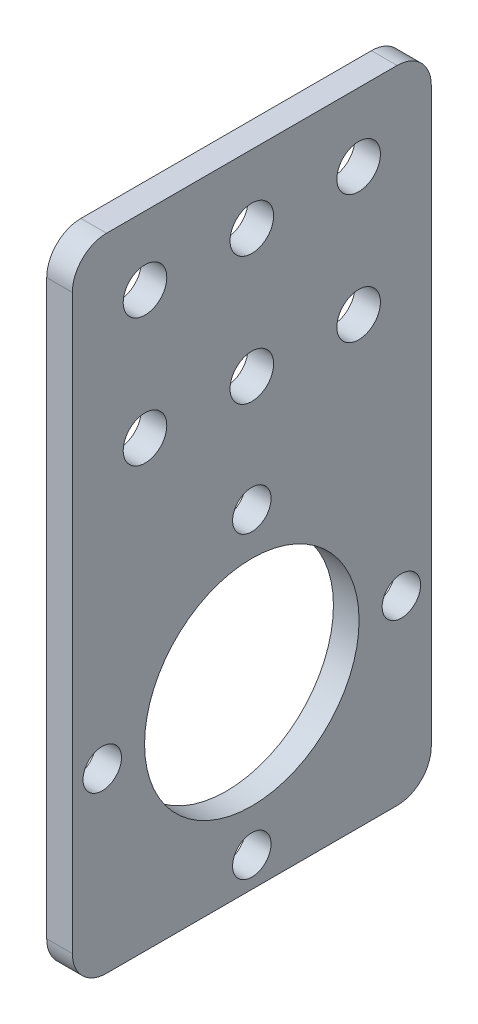
ISO-10303-21;
HEADER;
FILE_DESCRIPTION(('STEP AP214'),'2;1');
FILE_NAME('part.step','',(''),(''),'','','');
FILE_SCHEMA(('AUTOMOTIVE_DESIGN { 1 0 10303 214 1 1 1 1 }'));
ENDSEC;
DATA;
#1=APPLICATION_CONTEXT('core data for automotive mechanical design processes');
#2=APPLICATION_PROTOCOL_DEFINITION('international standard','automotive_design',2000,#1);
#3=PRODUCT_CONTEXT('',#1,'mechanical');
#4=PRODUCT('Part','Part','',(#3));
#5=PRODUCT_RELATED_PRODUCT_CATEGORY('part','',(#4));
#6=PRODUCT_DEFINITION_FORMATION('','',#4);
#7=PRODUCT_DEFINITION_CONTEXT('part definition',#1,'design');
#8=PRODUCT_DEFINITION('design','',#6,#7);
#9=PRODUCT_DEFINITION_SHAPE('','',#8);
#10=(LENGTH_UNIT() NAMED_UNIT(*) SI_UNIT(.MILLI.,.METRE.));
#11=(NAMED_UNIT(*) PLANE_ANGLE_UNIT() SI_UNIT($,.RADIAN.));
#12=(NAMED_UNIT(*) SI_UNIT($,.STERADIAN.) SOLID_ANGLE_UNIT());
#13=UNCERTAINTY_MEASURE_WITH_UNIT(LENGTH_MEASURE(1.E-05),#10,'distance_accuracy_value','');
#14=(GEOMETRIC_REPRESENTATION_CONTEXT(3) GLOBAL_UNCERTAINTY_ASSIGNED_CONTEXT((#13)) GLOBAL_UNIT_ASSIGNED_CONTEXT((#10,
#11,#12)) REPRESENTATION_CONTEXT('',''));
#15=CARTESIAN_POINT('',(0.,0.,0.));
#16=DIRECTION('',(0.,0.,1.));
#17=DIRECTION('',(1.,0.,0.));
#18=AXIS2_PLACEMENT_3D('',#15,#16,#17);
#19=CARTESIAN_POINT('',(-12.4999900001975,-16.9999999999864,-464.831385650778));
#20=DIRECTION('',(1.,3.56744395928794E-13,-3.81916720471054E-13));
#21=DIRECTION('',(-3.56744395928794E-13,1.,0.));
#22=AXIS2_PLACEMENT_3D('',#19,#20,#21);
#23=PLANE('',#22);
#24=CARTESIAN_POINT('',(-12.4999900002162,31.0000100000136,-469.331385650778));
#25=DIRECTION('',(-1.,-3.56744395928794E-13,3.81916720471054E-13));
#26=DIRECTION('',(-3.56744395928794E-13,1.,0.));
#27=AXIS2_PLACEMENT_3D('',#24,#25,#26);
#28=CIRCLE('',#27,2.55);
#29=CARTESIAN_POINT('',(-12.4999900002171,33.5500100000136,-469.331385650778));
#30=VERTEX_POINT('',#29);
#31=EDGE_CURVE('E389',#30,#30,#28,.T.);
#32=ORIENTED_EDGE('',*,*,#31,.T.);
#33=EDGE_LOOP('',(#32));
#34=FACE_BOUND('',#33,.T.);
#35=CARTESIAN_POINT('',(-12.49999000021,1.35622800243338E-11,-481.831385650778));
#36=DIRECTION('',(-1.,-3.56744395928794E-13,3.81916720471054E-13));
#37=DIRECTION('',(-3.56744395928794E-13,1.,0.));
#38=AXIS2_PLACEMENT_3D('',#35,#36,#37);
#39=CIRCLE('',#38,12.55);
#40=CARTESIAN_POINT('',(-12.4999900002145,12.5500000000136,-481.831385650778));
#41=VERTEX_POINT('',#40);
#42=EDGE_CURVE('E400',#41,#41,#39,.T.);
#43=ORIENTED_EDGE('',*,*,#42,.T.);
#44=EDGE_LOOP('',(#43));
#45=FACE_BOUND('',#44,.T.);
#46=CARTESIAN_POINT('',(-12.4999900002217,46.0000100000136,-469.331385650778));
#47=DIRECTION('',(-1.,-3.56744395928794E-13,3.81916720471054E-13));
#48=DIRECTION('',(-3.56744395928794E-13,1.,0.));
#49=AXIS2_PLACEMENT_3D('',#46,#47,#48);
#50=CIRCLE('',#49,2.55);
#51=CARTESIAN_POINT('',(-12.4999900002226,48.5500100000136,-469.331385650778));
#52=VERTEX_POINT('',#51);
#53=EDGE_CURVE('E412',#52,#52,#50,.T.);
#54=ORIENTED_EDGE('',*,*,#53,.T.);
#55=EDGE_LOOP('',(#54));
#56=FACE_BOUND('',#55,.T.);
#57=CARTESIAN_POINT('',(-12.4999900002162,17.5000000000136,-481.831385650778));
#58=DIRECTION('',(-1.,-3.56744395928794E-13,3.81916720471054E-13));
#59=DIRECTION('',(-3.56744395928794E-13,1.,0.));
#60=AXIS2_PLACEMENT_3D('',#57,#58,#59);
#61=CIRCLE('',#60,2.25);
#62=CARTESIAN_POINT('',(-12.499990000217,19.7500000000136,-481.831385650778));
#63=VERTEX_POINT('',#62);
#64=EDGE_CURVE('E424',#63,#63,#61,.T.);
#65=ORIENTED_EDGE('',*,*,#64,.T.);
#66=EDGE_LOOP('',(#65));
#67=FACE_BOUND('',#66,.T.);
#68=CARTESIAN_POINT('',(-12.4999900002038,-17.4999999999864,-481.831385650778));
#69=DIRECTION('',(-1.,-3.56744395928794E-13,3.81916720471054E-13));
#70=DIRECTION('',(-3.56744395928794E-13,1.,0.));
#71=AXIS2_PLACEMENT_3D('',#68,#69,#70);
#72=CIRCLE('',#71,2.25);
#73=CARTESIAN_POINT('',(-12.4999900002046,-15.2499999999864,-481.831385650778));
#74=VERTEX_POINT('',#73);
#75=EDGE_CURVE('E436',#74,#74,#72,.T.);
#76=ORIENTED_EDGE('',*,*,#75,.T.);
#77=EDGE_LOOP('',(#76));
#78=FACE_BOUND('',#77,.T.);
#79=CARTESIAN_POINT('',(-12.4999900001975,-16.9999999999864,-464.831385650778));
#80=DIRECTION('',(-1.,-3.56744395928794E-13,3.81916720471054E-13));
#81=DIRECTION('',(-3.56744395928794E-13,1.,0.));
#82=AXIS2_PLACEMENT_3D('',#79,#80,#81);
#83=CIRCLE('',#82,4.);
#84=CARTESIAN_POINT('',(-12.499990000196,-20.9999999999864,-464.831385650778));
#85=VERTEX_POINT('',#84);
#86=CARTESIAN_POINT('',(-12.499990000196,-16.9999999999864,-460.831385650778));
#87=VERTEX_POINT('',#86);
#88=EDGE_CURVE('E151',#85,#87,#83,.T.);
#89=ORIENTED_EDGE('',*,*,#88,.F.);
#90=DIRECTION('',(3.81916720471054E-13,0.,1.));
#91=VECTOR('',#90,1.);
#92=CARTESIAN_POINT('',(-12.499990000209,-20.9999999999864,-498.831385650778));
#93=LINE('',#92,#91);
#94=CARTESIAN_POINT('',(-12.499990000209,-20.9999999999864,-498.831385650778));
#95=VERTEX_POINT('',#94);
#96=EDGE_CURVE('E125',#95,#85,#93,.T.);
#97=ORIENTED_EDGE('',*,*,#96,.F.);
#98=CARTESIAN_POINT('',(-12.4999900002103,-16.9999999999864,-498.831385650778));
#99=DIRECTION('',(-1.,-3.56744395928794E-13,3.81916720471054E-13));
#100=DIRECTION('',(3.56744395928794E-13,-1.,0.));
#101=AXIS2_PLACEMENT_3D('',#98,#99,#100);
#102=CIRCLE('',#101,4.);
#103=CARTESIAN_POINT('',(-12.4999900002119,-16.9999999999864,-502.831385650778));
#104=VERTEX_POINT('',#103);
#105=EDGE_CURVE('E106',#104,#95,#102,.T.);
#106=ORIENTED_EDGE('',*,*,#105,.F.);
#107=DIRECTION('',(3.56731642567291E-13,-1.,0.));
#108=VECTOR('',#107,1.);
#109=CARTESIAN_POINT('',(-12.4999900002119,-16.9999999999864,-502.831385650778));
#110=LINE('',#109,#108);
#111=CARTESIAN_POINT('',(-12.4999900002359,50.0000000000135,-502.831385650778));
#112=VERTEX_POINT('',#111);
#113=EDGE_CURVE('E116',#112,#104,#110,.T.);
#114=ORIENTED_EDGE('',*,*,#113,.F.);
#115=CARTESIAN_POINT('',(-12.4999900002343,50.0000000000136,-498.831385650778));
#116=DIRECTION('',(-1.,-3.56744395928794E-13,3.81916720471054E-13));
#117=DIRECTION('',(3.56744395928794E-13,-1.,0.));
#118=AXIS2_PLACEMENT_3D('',#115,#116,#117);
#119=CIRCLE('',#118,4.);
#120=CARTESIAN_POINT('',(-12.4999900002357,54.0000000000136,-498.831385650778));
#121=VERTEX_POINT('',#120);
#122=EDGE_CURVE('E121',#121,#112,#119,.T.);
#123=ORIENTED_EDGE('',*,*,#122,.F.);
#124=DIRECTION('',(-3.81916720471054E-13,0.,-1.));
#125=VECTOR('',#124,1.);
#126=CARTESIAN_POINT('',(-12.4999900002357,54.0000000000136,-498.831385650778));
#127=LINE('',#126,#125);
#128=CARTESIAN_POINT('',(-12.4999900002228,54.0000000000136,-464.831385650778));
#129=VERTEX_POINT('',#128);
#130=EDGE_CURVE('E177',#129,#121,#127,.T.);
#131=ORIENTED_EDGE('',*,*,#130,.F.);
#132=CARTESIAN_POINT('',(-12.4999900002213,50.0000000000136,-464.831385650778));
#133=DIRECTION('',(-1.,-3.56744395928794E-13,3.81916720471054E-13));
#134=DIRECTION('',(3.56744395928794E-13,-1.,0.));
#135=AXIS2_PLACEMENT_3D('',#132,#133,#134);
#136=CIRCLE('',#135,4.);
#137=CARTESIAN_POINT('',(-12.49999000022,50.0000000000135,-460.831385650778));
#138=VERTEX_POINT('',#137);
#139=EDGE_CURVE('E170',#138,#129,#136,.T.);
#140=ORIENTED_EDGE('',*,*,#139,.F.);
#141=DIRECTION('',(-3.56731642567291E-13,1.,0.));
#142=VECTOR('',#141,1.);
#143=CARTESIAN_POINT('',(-12.499990000196,-16.9999999999864,-460.831385650778));
#144=LINE('',#143,#142);
#145=EDGE_CURVE('E160',#87,#138,#144,.T.);
#146=ORIENTED_EDGE('',*,*,#145,.F.);
#147=EDGE_LOOP('',(#89,#97,#106,#114,#123,#131,#140,#146));
#148=FACE_BOUND('',#147,.T.);
#149=CARTESIAN_POINT('',(-12.4999900002166,1.35622859668917E-11,-499.331385650778));
#150=DIRECTION('',(-1.,-3.56744395928794E-13,3.81916720471054E-13));
#151=DIRECTION('',(-3.56744395928794E-13,1.,0.));
#152=AXIS2_PLACEMENT_3D('',#149,#150,#151);
#153=CIRCLE('',#152,2.25);
#154=CARTESIAN_POINT('',(-12.4999900002174,2.25000000001356,-499.331385650778));
#155=VERTEX_POINT('',#154);
#156=EDGE_CURVE('E134',#155,#155,#153,.T.);
#157=ORIENTED_EDGE('',*,*,#156,.T.);
#158=EDGE_LOOP('',(#157));
#159=FACE_BOUND('',#158,.T.);
#160=CARTESIAN_POINT('',(-12.4999900002032,1.35622859668917E-11,-464.331385650778));
#161=DIRECTION('',(-1.,-3.56744395928794E-13,3.81916720471054E-13));
#162=DIRECTION('',(-3.56744395928794E-13,1.,0.));
#163=AXIS2_PLACEMENT_3D('',#160,#161,#162);
#164=CIRCLE('',#163,2.25);
#165=CARTESIAN_POINT('',(-12.499990000204,2.25000000001357,-464.331385650778));
#166=VERTEX_POINT('',#165);
#167=EDGE_CURVE('E430',#166,#166,#164,.T.);
#168=ORIENTED_EDGE('',*,*,#167,.T.);
#169=EDGE_LOOP('',(#168));
#170=FACE_BOUND('',#169,.T.);
#171=CARTESIAN_POINT('',(-12.4999900002264,46.0000100000136,-481.831385650778));
#172=DIRECTION('',(-1.,-3.56744395928794E-13,3.81916720471054E-13));
#173=DIRECTION('',(-3.56744395928794E-13,1.,0.));
#174=AXIS2_PLACEMENT_3D('',#171,#172,#173);
#175=CIRCLE('',#174,2.55);
#176=CARTESIAN_POINT('',(-12.4999900002274,48.5500100000136,-481.831385650778));
#177=VERTEX_POINT('',#176);
#178=EDGE_CURVE('E418',#177,#177,#175,.T.);
#179=ORIENTED_EDGE('',*,*,#178,.T.);
#180=EDGE_LOOP('',(#179));
#181=FACE_BOUND('',#180,.T.);
#182=CARTESIAN_POINT('',(-12.4999900002312,46.0000100000136,-494.331385650778));
#183=DIRECTION('',(-1.,-3.56744395928794E-13,3.81916720471054E-13));
#184=DIRECTION('',(-3.56744395928794E-13,1.,0.));
#185=AXIS2_PLACEMENT_3D('',#182,#183,#184);
#186=CIRCLE('',#185,2.55);
#187=CARTESIAN_POINT('',(-12.4999900002321,48.5500100000136,-494.331385650778));
#188=VERTEX_POINT('',#187);
#189=EDGE_CURVE('E406',#188,#188,#186,.T.);
#190=ORIENTED_EDGE('',*,*,#189,.T.);
#191=EDGE_LOOP('',(#190));
#192=FACE_BOUND('',#191,.T.);
#193=CARTESIAN_POINT('',(-12.4999900002211,31.0000100000136,-481.831385650778));
#194=DIRECTION('',(-1.,-3.56744395928794E-13,3.81916720471054E-13));
#195=DIRECTION('',(-3.56744395928794E-13,1.,0.));
#196=AXIS2_PLACEMENT_3D('',#193,#194,#195);
#197=CIRCLE('',#196,2.55);
#198=CARTESIAN_POINT('',(-12.499990000222,33.5500100000136,-481.831385650778));
#199=VERTEX_POINT('',#198);
#200=EDGE_CURVE('E394',#199,#199,#197,.T.);
#201=ORIENTED_EDGE('',*,*,#200,.T.);
#202=EDGE_LOOP('',(#201));
#203=FACE_BOUND('',#202,.T.);
#204=CARTESIAN_POINT('',(-12.4999900002258,31.0000100000136,-494.331385650778));
#205=DIRECTION('',(-1.,-3.56744395928794E-13,3.81916720471054E-13));
#206=DIRECTION('',(-3.56744395928794E-13,1.,0.));
#207=AXIS2_PLACEMENT_3D('',#204,#205,#206);
#208=CIRCLE('',#207,2.55);
#209=CARTESIAN_POINT('',(-12.4999900002267,33.5500100000136,-494.331385650778));
#210=VERTEX_POINT('',#209);
#211=EDGE_CURVE('E380',#210,#210,#208,.T.);
#212=ORIENTED_EDGE('',*,*,#211,.T.);
#213=EDGE_LOOP('',(#212));
#214=FACE_BOUND('',#213,.T.);
#215=ADVANCED_FACE('F33',(#34,#45,#56,#67,#78,#148,#159,#170,#181,#192,#203,#214),#23,.T.);
#216=CARTESIAN_POINT('',(-15.4999900001974,-16.9999999999875,-464.831385650777));
#217=DIRECTION('',(1.,3.56744395928794E-13,-3.81916720471054E-13));
#218=DIRECTION('',(-3.56744395928794E-13,1.,0.));
#219=AXIS2_PLACEMENT_3D('',#216,#217,#218);
#220=PLANE('',#219);
#221=CARTESIAN_POINT('',(-15.4999900001974,-16.9999999999875,-464.831385650777));
#222=DIRECTION('',(-1.,-3.56744395928794E-13,3.81916720471054E-13));
#223=DIRECTION('',(-3.56744395928794E-13,1.,0.));
#224=AXIS2_PLACEMENT_3D('',#221,#222,#223);
#225=CIRCLE('',#224,4.);
#226=CARTESIAN_POINT('',(-15.4999900001961,-20.9999999999875,-464.831385650777));
#227=VERTEX_POINT('',#226);
#228=CARTESIAN_POINT('',(-15.4999900001959,-16.9999999999875,-460.831385650777));
#229=VERTEX_POINT('',#228);
#230=EDGE_CURVE('E130',#227,#229,#225,.T.);
#231=ORIENTED_EDGE('',*,*,#230,.T.);
#232=DIRECTION('',(-3.56731642567291E-13,1.,0.));
#233=VECTOR('',#232,1.);
#234=CARTESIAN_POINT('',(-15.4999900001959,-16.9999999999875,-460.831385650777));
#235=LINE('',#234,#233);
#236=CARTESIAN_POINT('',(-15.4999900002198,50.0000000000124,-460.831385650777));
#237=VERTEX_POINT('',#236);
#238=EDGE_CURVE('E133',#229,#237,#235,.T.);
#239=ORIENTED_EDGE('',*,*,#238,.T.);
#240=CARTESIAN_POINT('',(-15.4999900002214,50.0000000000125,-464.831385650777));
#241=DIRECTION('',(-1.,-3.56744395928794E-13,3.81916720471054E-13));
#242=DIRECTION('',(3.56744395928794E-13,-1.,0.));
#243=AXIS2_PLACEMENT_3D('',#240,#241,#242);
#244=CIRCLE('',#243,4.);
#245=CARTESIAN_POINT('',(-15.4999900002227,54.0000000000125,-464.831385650777));
#246=VERTEX_POINT('',#245);
#247=EDGE_CURVE('E137',#237,#246,#244,.T.);
#248=ORIENTED_EDGE('',*,*,#247,.T.);
#249=DIRECTION('',(-3.81916720471054E-13,0.,-1.));
#250=VECTOR('',#249,1.);
#251=CARTESIAN_POINT('',(-15.4999900002358,54.0000000000125,-498.831385650777));
#252=LINE('',#251,#250);
#253=CARTESIAN_POINT('',(-15.4999900002358,54.0000000000125,-498.831385650777));
#254=VERTEX_POINT('',#253);
#255=EDGE_CURVE('E140',#246,#254,#252,.T.);
#256=ORIENTED_EDGE('',*,*,#255,.T.);
#257=CARTESIAN_POINT('',(-15.4999900002344,50.0000000000125,-498.831385650777));
#258=DIRECTION('',(-1.,-3.56744395928794E-13,3.81916720471054E-13));
#259=DIRECTION('',(3.56744395928794E-13,-1.,0.));
#260=AXIS2_PLACEMENT_3D('',#257,#258,#259);
#261=CIRCLE('',#260,4.);
#262=CARTESIAN_POINT('',(-15.4999900002358,50.0000000000124,-502.831385650777));
#263=VERTEX_POINT('',#262);
#264=EDGE_CURVE('E143',#254,#263,#261,.T.);
#265=ORIENTED_EDGE('',*,*,#264,.T.);
#266=DIRECTION('',(3.56731642567291E-13,-1.,0.));
#267=VECTOR('',#266,1.);
#268=CARTESIAN_POINT('',(-15.499990000212,-16.9999999999875,-502.831385650777));
#269=LINE('',#268,#267);
#270=CARTESIAN_POINT('',(-15.499990000212,-16.9999999999875,-502.831385650777));
#271=VERTEX_POINT('',#270);
#272=EDGE_CURVE('E146',#263,#271,#269,.T.);
#273=ORIENTED_EDGE('',*,*,#272,.T.);
#274=CARTESIAN_POINT('',(-15.4999900002105,-16.9999999999875,-498.831385650777));
#275=DIRECTION('',(-1.,-3.56744395928794E-13,3.81916720471054E-13));
#276=DIRECTION('',(3.56744395928794E-13,-1.,0.));
#277=AXIS2_PLACEMENT_3D('',#274,#275,#276);
#278=CIRCLE('',#277,4.);
#279=CARTESIAN_POINT('',(-15.4999900002089,-20.9999999999875,-498.831385650777));
#280=VERTEX_POINT('',#279);
#281=EDGE_CURVE('E109',#271,#280,#278,.T.);
#282=ORIENTED_EDGE('',*,*,#281,.T.);
#283=DIRECTION('',(3.81916720471054E-13,0.,1.));
#284=VECTOR('',#283,1.);
#285=CARTESIAN_POINT('',(-15.4999900002089,-20.9999999999875,-498.831385650777));
#286=LINE('',#285,#284);
#287=EDGE_CURVE('E149',#280,#227,#286,.T.);
#288=ORIENTED_EDGE('',*,*,#287,.T.);
#289=EDGE_LOOP('',(#231,#239,#248,#256,#265,#273,#282,#288));
#290=FACE_BOUND('',#289,.T.);
#291=CARTESIAN_POINT('',(-15.4999900002167,1.24920527791054E-11,-499.331385650777));
#292=DIRECTION('',(-1.,-3.56744395928794E-13,3.81916720471054E-13));
#293=DIRECTION('',(-3.56744395928794E-13,1.,0.));
#294=AXIS2_PLACEMENT_3D('',#291,#292,#293);
#295=CIRCLE('',#294,2.25);
#296=CARTESIAN_POINT('',(-15.4999900002175,2.25000000001249,-499.331385650777));
#297=VERTEX_POINT('',#296);
#298=EDGE_CURVE('E173',#297,#297,#295,.T.);
#299=ORIENTED_EDGE('',*,*,#298,.F.);
#300=EDGE_LOOP('',(#299));
#301=FACE_BOUND('',#300,.T.);
#302=CARTESIAN_POINT('',(-15.4999900002037,-17.4999999999875,-481.831385650777));
#303=DIRECTION('',(-1.,-3.56744395928794E-13,3.81916720471054E-13));
#304=DIRECTION('',(-3.56744395928794E-13,1.,0.));
#305=AXIS2_PLACEMENT_3D('',#302,#303,#304);
#306=CIRCLE('',#305,2.25);
#307=CARTESIAN_POINT('',(-15.4999900002045,-15.2499999999875,-481.831385650777));
#308=VERTEX_POINT('',#307);
#309=EDGE_CURVE('E433',#308,#308,#306,.T.);
#310=ORIENTED_EDGE('',*,*,#309,.F.);
#311=EDGE_LOOP('',(#310));
#312=FACE_BOUND('',#311,.T.);
#313=CARTESIAN_POINT('',(-15.4999900002034,1.24920527791054E-11,-464.331385650777));
#314=DIRECTION('',(-1.,-3.56744395928794E-13,3.81916720471054E-13));
#315=DIRECTION('',(-3.56744395928794E-13,1.,0.));
#316=AXIS2_PLACEMENT_3D('',#313,#314,#315);
#317=CIRCLE('',#316,2.25);
#318=CARTESIAN_POINT('',(-15.4999900002042,2.25000000001249,-464.331385650777));
#319=VERTEX_POINT('',#318);
#320=EDGE_CURVE('E427',#319,#319,#317,.T.);
#321=ORIENTED_EDGE('',*,*,#320,.F.);
#322=EDGE_LOOP('',(#321));
#323=FACE_BOUND('',#322,.T.);
#324=CARTESIAN_POINT('',(-15.4999900002163,17.5000000000125,-481.831385650777));
#325=DIRECTION('',(-1.,-3.56744395928794E-13,3.81916720471054E-13));
#326=DIRECTION('',(-3.56744395928794E-13,1.,0.));
#327=AXIS2_PLACEMENT_3D('',#324,#325,#326);
#328=CIRCLE('',#327,2.25);
#329=CARTESIAN_POINT('',(-15.4999900002171,19.7500000000125,-481.831385650777));
#330=VERTEX_POINT('',#329);
#331=EDGE_CURVE('E421',#330,#330,#328,.T.);
#332=ORIENTED_EDGE('',*,*,#331,.F.);
#333=EDGE_LOOP('',(#332));
#334=FACE_BOUND('',#333,.T.);
#335=CARTESIAN_POINT('',(-15.4999900002263,46.0000100000125,-481.831385650777));
#336=DIRECTION('',(-1.,-3.56744395928794E-13,3.81916720471054E-13));
#337=DIRECTION('',(-3.56744395928794E-13,1.,0.));
#338=AXIS2_PLACEMENT_3D('',#335,#336,#337);
#339=CIRCLE('',#338,2.55);
#340=CARTESIAN_POINT('',(-15.4999900002272,48.5500100000125,-481.831385650777));
#341=VERTEX_POINT('',#340);
#342=EDGE_CURVE('E415',#341,#341,#339,.T.);
#343=ORIENTED_EDGE('',*,*,#342,.F.);
#344=EDGE_LOOP('',(#343));
#345=FACE_BOUND('',#344,.T.);
#346=CARTESIAN_POINT('',(-15.4999900002216,46.0000100000125,-469.331385650777));
#347=DIRECTION('',(-1.,-3.56744395928794E-13,3.81916720471054E-13));
#348=DIRECTION('',(-3.56744395928794E-13,1.,0.));
#349=AXIS2_PLACEMENT_3D('',#346,#347,#348);
#350=CIRCLE('',#349,2.55);
#351=CARTESIAN_POINT('',(-15.4999900002225,48.5500100000125,-469.331385650777));
#352=VERTEX_POINT('',#351);
#353=EDGE_CURVE('E409',#352,#352,#350,.T.);
#354=ORIENTED_EDGE('',*,*,#353,.F.);
#355=EDGE_LOOP('',(#354));
#356=FACE_BOUND('',#355,.T.);
#357=CARTESIAN_POINT('',(-15.4999900002313,46.0000100000125,-494.331385650777));
#358=DIRECTION('',(-1.,-3.56744395928794E-13,3.81916720471054E-13));
#359=DIRECTION('',(-3.56744395928794E-13,1.,0.));
#360=AXIS2_PLACEMENT_3D('',#357,#358,#359);
#361=CIRCLE('',#360,2.55);
#362=CARTESIAN_POINT('',(-15.4999900002322,48.5500100000125,-494.331385650777));
#363=VERTEX_POINT('',#362);
#364=EDGE_CURVE('E403',#363,#363,#361,.T.);
#365=ORIENTED_EDGE('',*,*,#364,.F.);
#366=EDGE_LOOP('',(#365));
#367=FACE_BOUND('',#366,.T.);
#368=CARTESIAN_POINT('',(-15.4999900002099,1.24920468365474E-11,-481.831385650777));
#369=DIRECTION('',(-1.,-3.56744395928794E-13,3.81916720471054E-13));
#370=DIRECTION('',(-3.56744395928794E-13,1.,0.));
#371=AXIS2_PLACEMENT_3D('',#368,#369,#370);
#372=CIRCLE('',#371,12.55);
#373=CARTESIAN_POINT('',(-15.4999900002144,12.5500000000125,-481.831385650777));
#374=VERTEX_POINT('',#373);
#375=EDGE_CURVE('E397',#374,#374,#372,.T.);
#376=ORIENTED_EDGE('',*,*,#375,.F.);
#377=EDGE_LOOP('',(#376));
#378=FACE_BOUND('',#377,.T.);
#379=CARTESIAN_POINT('',(-15.499990000221,31.0000100000125,-481.831385650777));
#380=DIRECTION('',(-1.,-3.56744395928794E-13,3.81916720471054E-13));
#381=DIRECTION('',(-3.56744395928794E-13,1.,0.));
#382=AXIS2_PLACEMENT_3D('',#379,#380,#381);
#383=CIRCLE('',#382,2.55);
#384=CARTESIAN_POINT('',(-15.4999900002219,33.5500100000125,-481.831385650777));
#385=VERTEX_POINT('',#384);
#386=EDGE_CURVE('E391',#385,#385,#383,.T.);
#387=ORIENTED_EDGE('',*,*,#386,.F.);
#388=EDGE_LOOP('',(#387));
#389=FACE_BOUND('',#388,.T.);
#390=CARTESIAN_POINT('',(-15.4999900002163,31.0000100000125,-469.331385650777));
#391=DIRECTION('',(-1.,-3.56744395928794E-13,3.81916720471054E-13));
#392=DIRECTION('',(-3.56744395928794E-13,1.,0.));
#393=AXIS2_PLACEMENT_3D('',#390,#391,#392);
#394=CIRCLE('',#393,2.55);
#395=CARTESIAN_POINT('',(-15.4999900002172,33.5500100000125,-469.331385650777));
#396=VERTEX_POINT('',#395);
#397=EDGE_CURVE('E386',#396,#396,#394,.T.);
#398=ORIENTED_EDGE('',*,*,#397,.F.);
#399=EDGE_LOOP('',(#398));
#400=FACE_BOUND('',#399,.T.);
#401=CARTESIAN_POINT('',(-15.4999900002257,31.0000100000125,-494.331385650777));
#402=DIRECTION('',(-1.,-3.56744395928794E-13,3.81916720471054E-13));
#403=DIRECTION('',(-3.56744395928794E-13,1.,0.));
#404=AXIS2_PLACEMENT_3D('',#401,#402,#403);
#405=CIRCLE('',#404,2.55);
#406=CARTESIAN_POINT('',(-15.4999900002266,33.5500100000125,-494.331385650777));
#407=VERTEX_POINT('',#406);
#408=EDGE_CURVE('E383',#407,#407,#405,.T.);
#409=ORIENTED_EDGE('',*,*,#408,.F.);
#410=EDGE_LOOP('',(#409));
#411=FACE_BOUND('',#410,.T.);
#412=ADVANCED_FACE('F167',(#290,#301,#312,#323,#334,#345,#356,#367,#378,#389,#400,#411),#220,.F.);
#413=CARTESIAN_POINT('',(-12.4999900001975,-16.9999999999864,-464.831385650778));
#414=DIRECTION('',(-1.,-3.56744395928794E-13,3.81916720471054E-13));
#415=DIRECTION('',(3.56744395928794E-13,-1.,0.));
#416=AXIS2_PLACEMENT_3D('',#413,#414,#415);
#417=CYLINDRICAL_SURFACE('',#416,4.);
#418=ORIENTED_EDGE('',*,*,#230,.F.);
#419=DIRECTION('',(-1.,-3.56744395928794E-13,3.81916720471054E-13));
#420=VECTOR('',#419,1.);
#421=CARTESIAN_POINT('',(-12.499990000196,-20.9999999999864,-464.831385650778));
#422=LINE('',#421,#420);
#423=EDGE_CURVE('E50',#85,#227,#422,.T.);
#424=ORIENTED_EDGE('',*,*,#423,.F.);
#425=ORIENTED_EDGE('',*,*,#88,.T.);
#426=DIRECTION('',(-1.,-3.56744395928794E-13,3.81916720471054E-13));
#427=VECTOR('',#426,1.);
#428=CARTESIAN_POINT('',(-12.499990000196,-16.9999999999864,-460.831385650778));
#429=LINE('',#428,#427);
#430=EDGE_CURVE('E11',#87,#229,#429,.T.);
#431=ORIENTED_EDGE('',*,*,#430,.T.);
#432=EDGE_LOOP('',(#418,#424,#425,#431));
#433=FACE_BOUND('',#432,.T.);
#434=ADVANCED_FACE('F35',(#433),#417,.T.);
#435=CARTESIAN_POINT('',(-12.499990000196,-16.9999999999864,-460.831385650778));
#436=DIRECTION('',(-3.81916720471054E-13,0.,-1.));
#437=DIRECTION('',(1.,0.,-3.81916720471054E-13));
#438=AXIS2_PLACEMENT_3D('',#435,#436,#437);
#439=PLANE('',#438);
#440=ORIENTED_EDGE('',*,*,#238,.F.);
#441=ORIENTED_EDGE('',*,*,#430,.F.);
#442=ORIENTED_EDGE('',*,*,#145,.T.);
#443=DIRECTION('',(-1.,-3.56744395928794E-13,3.81916720471054E-13));
#444=VECTOR('',#443,1.);
#445=CARTESIAN_POINT('',(-12.49999000022,50.0000000000135,-460.831385650778));
#446=LINE('',#445,#444);
#447=EDGE_CURVE('E42',#138,#237,#446,.T.);
#448=ORIENTED_EDGE('',*,*,#447,.T.);
#449=EDGE_LOOP('',(#440,#441,#442,#448));
#450=FACE_BOUND('',#449,.T.);
#451=ADVANCED_FACE('F159',(#450),#439,.F.);
#452=CARTESIAN_POINT('',(-12.4999900002213,50.0000000000136,-464.831385650778));
#453=DIRECTION('',(-1.,-3.56744395928794E-13,3.81916720471054E-13));
#454=DIRECTION('',(3.56744395928794E-13,-1.,0.));
#455=AXIS2_PLACEMENT_3D('',#452,#453,#454);
#456=CYLINDRICAL_SURFACE('',#455,4.);
#457=ORIENTED_EDGE('',*,*,#247,.F.);
#458=ORIENTED_EDGE('',*,*,#447,.F.);
#459=ORIENTED_EDGE('',*,*,#139,.T.);
#460=DIRECTION('',(-1.,-3.56744395928794E-13,3.81916720471054E-13));
#461=VECTOR('',#460,1.);
#462=CARTESIAN_POINT('',(-12.4999900002228,54.0000000000136,-464.831385650778));
#463=LINE('',#462,#461);
#464=EDGE_CURVE('E157',#129,#246,#463,.T.);
#465=ORIENTED_EDGE('',*,*,#464,.T.);
#466=EDGE_LOOP('',(#457,#458,#459,#465));
#467=FACE_BOUND('',#466,.T.);
#468=ADVANCED_FACE('F164',(#467),#456,.T.);
#469=CARTESIAN_POINT('',(-12.4999900002357,54.0000000000136,-498.831385650778));
#470=DIRECTION('',(3.56744395928794E-13,-1.,0.));
#471=DIRECTION('',(1.,3.56744395928794E-13,-3.81916720471054E-13));
#472=AXIS2_PLACEMENT_3D('',#469,#470,#471);
#473=PLANE('',#472);
#474=ORIENTED_EDGE('',*,*,#255,.F.);
#475=ORIENTED_EDGE('',*,*,#464,.F.);
#476=ORIENTED_EDGE('',*,*,#130,.T.);
#477=DIRECTION('',(-1.,-3.56744395928794E-13,3.81916720471054E-13));
#478=VECTOR('',#477,1.);
#479=CARTESIAN_POINT('',(-12.4999900002357,54.0000000000136,-498.831385650778));
#480=LINE('',#479,#478);
#481=EDGE_CURVE('E155',#121,#254,#480,.T.);
#482=ORIENTED_EDGE('',*,*,#481,.T.);
#483=EDGE_LOOP('',(#474,#475,#476,#482));
#484=FACE_BOUND('',#483,.T.);
#485=ADVANCED_FACE('F184',(#484),#473,.F.);
#486=CARTESIAN_POINT('',(-12.4999900002343,50.0000000000136,-498.831385650778));
#487=DIRECTION('',(-1.,-3.56744395928794E-13,3.81916720471054E-13));
#488=DIRECTION('',(3.56744395928794E-13,-1.,0.));
#489=AXIS2_PLACEMENT_3D('',#486,#487,#488);
#490=CYLINDRICAL_SURFACE('',#489,4.);
#491=ORIENTED_EDGE('',*,*,#264,.F.);
#492=ORIENTED_EDGE('',*,*,#481,.F.);
#493=ORIENTED_EDGE('',*,*,#122,.T.);
#494=DIRECTION('',(-1.,-3.56744395928794E-13,3.81916720471054E-13));
#495=VECTOR('',#494,1.);
#496=CARTESIAN_POINT('',(-12.4999900002359,50.0000000000135,-502.831385650778));
#497=LINE('',#496,#495);
#498=EDGE_CURVE('E113',#112,#263,#497,.T.);
#499=ORIENTED_EDGE('',*,*,#498,.T.);
#500=EDGE_LOOP('',(#491,#492,#493,#499));
#501=FACE_BOUND('',#500,.T.);
#502=ADVANCED_FACE('F181',(#501),#490,.T.);
#503=CARTESIAN_POINT('',(-12.4999900002119,-16.9999999999864,-502.831385650778));
#504=DIRECTION('',(3.81916720471054E-13,0.,1.));
#505=DIRECTION('',(-1.,0.,3.81916720471054E-13));
#506=AXIS2_PLACEMENT_3D('',#503,#504,#505);
#507=PLANE('',#506);
#508=ORIENTED_EDGE('',*,*,#272,.F.);
#509=ORIENTED_EDGE('',*,*,#498,.F.);
#510=ORIENTED_EDGE('',*,*,#113,.T.);
#511=DIRECTION('',(-1.,-3.56744395928794E-13,3.81916720471054E-13));
#512=VECTOR('',#511,1.);
#513=CARTESIAN_POINT('',(-12.4999900002119,-16.9999999999864,-502.831385650778));
#514=LINE('',#513,#512);
#515=EDGE_CURVE('E102',#104,#271,#514,.T.);
#516=ORIENTED_EDGE('',*,*,#515,.T.);
#517=EDGE_LOOP('',(#508,#509,#510,#516));
#518=FACE_BOUND('',#517,.T.);
#519=ADVANCED_FACE('F117',(#518),#507,.F.);
#520=CARTESIAN_POINT('',(-12.4999900002103,-16.9999999999864,-498.831385650778));
#521=DIRECTION('',(-1.,-3.56744395928794E-13,3.81916720471054E-13));
#522=DIRECTION('',(3.56744395928794E-13,-1.,0.));
#523=AXIS2_PLACEMENT_3D('',#520,#521,#522);
#524=CYLINDRICAL_SURFACE('',#523,4.);
#525=ORIENTED_EDGE('',*,*,#281,.F.);
#526=ORIENTED_EDGE('',*,*,#515,.F.);
#527=ORIENTED_EDGE('',*,*,#105,.T.);
#528=DIRECTION('',(-1.,-3.56744395928794E-13,3.81916720471054E-13));
#529=VECTOR('',#528,1.);
#530=CARTESIAN_POINT('',(-12.499990000209,-20.9999999999864,-498.831385650778));
#531=LINE('',#530,#529);
#532=EDGE_CURVE('E78',#95,#280,#531,.T.);
#533=ORIENTED_EDGE('',*,*,#532,.T.);
#534=EDGE_LOOP('',(#525,#526,#527,#533));
#535=FACE_BOUND('',#534,.T.);
#536=ADVANCED_FACE('F104',(#535),#524,.T.);
#537=CARTESIAN_POINT('',(-12.499990000209,-20.9999999999864,-498.831385650778));
#538=DIRECTION('',(-3.56744395928794E-13,1.,0.));
#539=DIRECTION('',(-1.,-3.56744395928794E-13,3.81916720471054E-13));
#540=AXIS2_PLACEMENT_3D('',#537,#538,#539);
#541=PLANE('',#540);
#542=ORIENTED_EDGE('',*,*,#287,.F.);
#543=ORIENTED_EDGE('',*,*,#532,.F.);
#544=ORIENTED_EDGE('',*,*,#96,.T.);
#545=ORIENTED_EDGE('',*,*,#423,.T.);
#546=EDGE_LOOP('',(#542,#543,#544,#545));
#547=FACE_BOUND('',#546,.T.);
#548=ADVANCED_FACE('F206',(#547),#541,.F.);
#549=CARTESIAN_POINT('',(-12.4999900002166,1.35622859668917E-11,-499.331385650778));
#550=DIRECTION('',(-1.,-3.56744395928794E-13,3.81916720471054E-13));
#551=DIRECTION('',(3.56744395928794E-13,-1.,0.));
#552=AXIS2_PLACEMENT_3D('',#549,#550,#551);
#553=CYLINDRICAL_SURFACE('',#552,2.25);
#554=ORIENTED_EDGE('',*,*,#156,.F.);
#555=EDGE_LOOP('',(#554));
#556=FACE_BOUND('',#555,.T.);
#557=ORIENTED_EDGE('',*,*,#298,.T.);
#558=EDGE_LOOP('',(#557));
#559=FACE_BOUND('',#558,.T.);
#560=ADVANCED_FACE('F203',(#556,#559),#553,.F.);
#561=CARTESIAN_POINT('',(-12.4999900002038,-17.4999999999864,-481.831385650778));
#562=DIRECTION('',(-1.,-3.56744395928794E-13,3.81916720471054E-13));
#563=DIRECTION('',(3.56744395928794E-13,-1.,0.));
#564=AXIS2_PLACEMENT_3D('',#561,#562,#563);
#565=CYLINDRICAL_SURFACE('',#564,2.25);
#566=ORIENTED_EDGE('',*,*,#75,.F.);
#567=EDGE_LOOP('',(#566));
#568=FACE_BOUND('',#567,.T.);
#569=ORIENTED_EDGE('',*,*,#309,.T.);
#570=EDGE_LOOP('',(#569));
#571=FACE_BOUND('',#570,.T.);
#572=ADVANCED_FACE('F233',(#568,#571),#565,.F.);
#573=CARTESIAN_POINT('',(-12.4999900002032,1.35622859668917E-11,-464.331385650778));
#574=DIRECTION('',(-1.,-3.56744395928794E-13,3.81916720471054E-13));
#575=DIRECTION('',(3.56744395928794E-13,-1.,0.));
#576=AXIS2_PLACEMENT_3D('',#573,#574,#575);
#577=CYLINDRICAL_SURFACE('',#576,2.25);
#578=ORIENTED_EDGE('',*,*,#167,.F.);
#579=EDGE_LOOP('',(#578));
#580=FACE_BOUND('',#579,.T.);
#581=ORIENTED_EDGE('',*,*,#320,.T.);
#582=EDGE_LOOP('',(#581));
#583=FACE_BOUND('',#582,.T.);
#584=ADVANCED_FACE('F241',(#580,#583),#577,.F.);
#585=CARTESIAN_POINT('',(-12.4999900002162,17.5000000000136,-481.831385650778));
#586=DIRECTION('',(-1.,-3.56744395928794E-13,3.81916720471054E-13));
#587=DIRECTION('',(3.56744395928794E-13,-1.,0.));
#588=AXIS2_PLACEMENT_3D('',#585,#586,#587);
#589=CYLINDRICAL_SURFACE('',#588,2.25);
#590=ORIENTED_EDGE('',*,*,#64,.F.);
#591=EDGE_LOOP('',(#590));
#592=FACE_BOUND('',#591,.T.);
#593=ORIENTED_EDGE('',*,*,#331,.T.);
#594=EDGE_LOOP('',(#593));
#595=FACE_BOUND('',#594,.T.);
#596=ADVANCED_FACE('F249',(#592,#595),#589,.F.);
#597=CARTESIAN_POINT('',(-12.4999900002264,46.0000100000136,-481.831385650778));
#598=DIRECTION('',(-1.,-3.56744395928794E-13,3.81916720471054E-13));
#599=DIRECTION('',(3.56744395928794E-13,-1.,0.));
#600=AXIS2_PLACEMENT_3D('',#597,#598,#599);
#601=CYLINDRICAL_SURFACE('',#600,2.55);
#602=ORIENTED_EDGE('',*,*,#178,.F.);
#603=EDGE_LOOP('',(#602));
#604=FACE_BOUND('',#603,.T.);
#605=ORIENTED_EDGE('',*,*,#342,.T.);
#606=EDGE_LOOP('',(#605));
#607=FACE_BOUND('',#606,.T.);
#608=ADVANCED_FACE('F258',(#604,#607),#601,.F.);
#609=CARTESIAN_POINT('',(-12.4999900002217,46.0000100000136,-469.331385650778));
#610=DIRECTION('',(-1.,-3.56744395928794E-13,3.81916720471054E-13));
#611=DIRECTION('',(3.56744395928794E-13,-1.,0.));
#612=AXIS2_PLACEMENT_3D('',#609,#610,#611);
#613=CYLINDRICAL_SURFACE('',#612,2.55);
#614=ORIENTED_EDGE('',*,*,#53,.F.);
#615=EDGE_LOOP('',(#614));
#616=FACE_BOUND('',#615,.T.);
#617=ORIENTED_EDGE('',*,*,#353,.T.);
#618=EDGE_LOOP('',(#617));
#619=FACE_BOUND('',#618,.T.);
#620=ADVANCED_FACE('F267',(#616,#619),#613,.F.);
#621=CARTESIAN_POINT('',(-12.4999900002312,46.0000100000136,-494.331385650778));
#622=DIRECTION('',(-1.,-3.56744395928794E-13,3.81916720471054E-13));
#623=DIRECTION('',(3.56744395928794E-13,-1.,0.));
#624=AXIS2_PLACEMENT_3D('',#621,#622,#623);
#625=CYLINDRICAL_SURFACE('',#624,2.55);
#626=ORIENTED_EDGE('',*,*,#189,.F.);
#627=EDGE_LOOP('',(#626));
#628=FACE_BOUND('',#627,.T.);
#629=ORIENTED_EDGE('',*,*,#364,.T.);
#630=EDGE_LOOP('',(#629));
#631=FACE_BOUND('',#630,.T.);
#632=ADVANCED_FACE('F276',(#628,#631),#625,.F.);
#633=CARTESIAN_POINT('',(-12.49999000021,1.35622800243338E-11,-481.831385650778));
#634=DIRECTION('',(-1.,-3.56744395928794E-13,3.81916720471054E-13));
#635=DIRECTION('',(3.56744395928794E-13,-1.,0.));
#636=AXIS2_PLACEMENT_3D('',#633,#634,#635);
#637=CYLINDRICAL_SURFACE('',#636,12.55);
#638=ORIENTED_EDGE('',*,*,#42,.F.);
#639=EDGE_LOOP('',(#638));
#640=FACE_BOUND('',#639,.T.);
#641=ORIENTED_EDGE('',*,*,#375,.T.);
#642=EDGE_LOOP('',(#641));
#643=FACE_BOUND('',#642,.T.);
#644=ADVANCED_FACE('F285',(#640,#643),#637,.F.);
#645=CARTESIAN_POINT('',(-12.4999900002211,31.0000100000136,-481.831385650778));
#646=DIRECTION('',(-1.,-3.56744395928794E-13,3.81916720471054E-13));
#647=DIRECTION('',(3.56744395928794E-13,-1.,0.));
#648=AXIS2_PLACEMENT_3D('',#645,#646,#647);
#649=CYLINDRICAL_SURFACE('',#648,2.55);
#650=ORIENTED_EDGE('',*,*,#200,.F.);
#651=EDGE_LOOP('',(#650));
#652=FACE_BOUND('',#651,.T.);
#653=ORIENTED_EDGE('',*,*,#386,.T.);
#654=EDGE_LOOP('',(#653));
#655=FACE_BOUND('',#654,.T.);
#656=ADVANCED_FACE('F294',(#652,#655),#649,.F.);
#657=CARTESIAN_POINT('',(-12.4999900002162,31.0000100000136,-469.331385650778));
#658=DIRECTION('',(-1.,-3.56744395928794E-13,3.81916720471054E-13));
#659=DIRECTION('',(3.56744395928794E-13,-1.,0.));
#660=AXIS2_PLACEMENT_3D('',#657,#658,#659);
#661=CYLINDRICAL_SURFACE('',#660,2.55);
#662=ORIENTED_EDGE('',*,*,#31,.F.);
#663=EDGE_LOOP('',(#662));
#664=FACE_BOUND('',#663,.T.);
#665=ORIENTED_EDGE('',*,*,#397,.T.);
#666=EDGE_LOOP('',(#665));
#667=FACE_BOUND('',#666,.T.);
#668=ADVANCED_FACE('F303',(#664,#667),#661,.F.);
#669=CARTESIAN_POINT('',(-12.4999900002258,31.0000100000136,-494.331385650778));
#670=DIRECTION('',(-1.,-3.56744395928794E-13,3.81916720471054E-13));
#671=DIRECTION('',(3.56744395928794E-13,-1.,0.));
#672=AXIS2_PLACEMENT_3D('',#669,#670,#671);
#673=CYLINDRICAL_SURFACE('',#672,2.55);
#674=ORIENTED_EDGE('',*,*,#211,.F.);
#675=EDGE_LOOP('',(#674));
#676=FACE_BOUND('',#675,.T.);
#677=ORIENTED_EDGE('',*,*,#408,.T.);
#678=EDGE_LOOP('',(#677));
#679=FACE_BOUND('',#678,.T.);
#680=ADVANCED_FACE('F312',(#676,#679),#673,.F.);
#681=CLOSED_SHELL('',(#215,#412,#434,#451,#468,#485,#502,#519,#536,#548,#560,#572,#584,#596,
#608,#620,#632,#644,#656,#668,#680));
#682=MANIFOLD_SOLID_BREP('B2',#681);
#683=ADVANCED_BREP_SHAPE_REPRESENTATION('',(#18,#682),#14);
#684=SHAPE_DEFINITION_REPRESENTATION(#9,#683);
ENDSEC;
END-ISO-10303-21;
